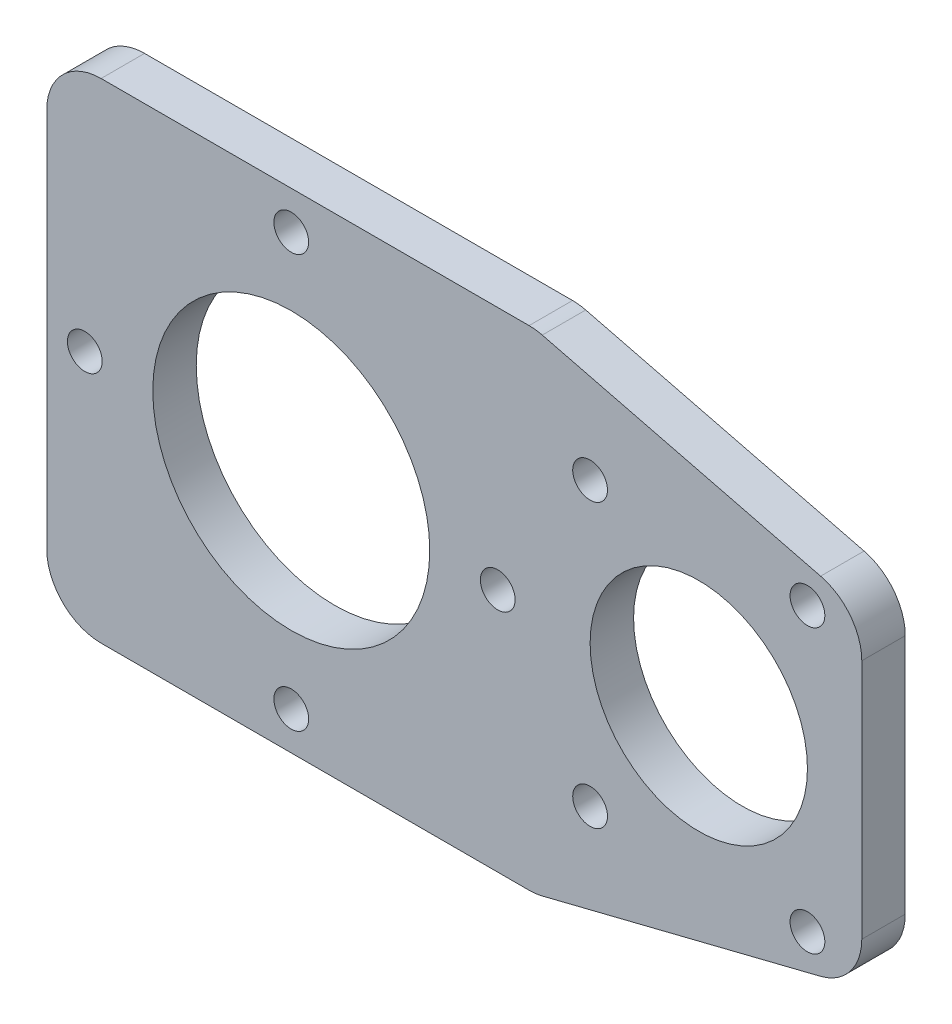
ISO-10303-21;
HEADER;
FILE_DESCRIPTION(('STEP AP214'),'2;1');
FILE_NAME('part.step','',(''),(''),'','','');
FILE_SCHEMA(('AUTOMOTIVE_DESIGN { 1 0 10303 214 1 1 1 1 }'));
ENDSEC;
DATA;
#1=APPLICATION_CONTEXT('core data for automotive mechanical design processes');
#2=APPLICATION_PROTOCOL_DEFINITION('international standard','automotive_design',2000,#1);
#3=PRODUCT_CONTEXT('',#1,'mechanical');
#4=PRODUCT('Part','Part','',(#3));
#5=PRODUCT_RELATED_PRODUCT_CATEGORY('part','',(#4));
#6=PRODUCT_DEFINITION_FORMATION('','',#4);
#7=PRODUCT_DEFINITION_CONTEXT('part definition',#1,'design');
#8=PRODUCT_DEFINITION('design','',#6,#7);
#9=PRODUCT_DEFINITION_SHAPE('','',#8);
#10=(LENGTH_UNIT() NAMED_UNIT(*) SI_UNIT(.MILLI.,.METRE.));
#11=(NAMED_UNIT(*) PLANE_ANGLE_UNIT() SI_UNIT($,.RADIAN.));
#12=(NAMED_UNIT(*) SI_UNIT($,.STERADIAN.) SOLID_ANGLE_UNIT());
#13=UNCERTAINTY_MEASURE_WITH_UNIT(LENGTH_MEASURE(1.E-05),#10,'distance_accuracy_value','');
#14=(GEOMETRIC_REPRESENTATION_CONTEXT(3) GLOBAL_UNCERTAINTY_ASSIGNED_CONTEXT((#13)) GLOBAL_UNIT_ASSIGNED_CONTEXT((#10,
#11,#12)) REPRESENTATION_CONTEXT('',''));
#15=CARTESIAN_POINT('',(0.,0.,0.));
#16=DIRECTION('',(0.,0.,1.));
#17=DIRECTION('',(1.,0.,0.));
#18=AXIS2_PLACEMENT_3D('',#15,#16,#17);
#19=CARTESIAN_POINT('',(0.,0.,4.));
#20=DIRECTION('',(0.,0.,1.));
#21=DIRECTION('',(1.,0.,0.));
#22=AXIS2_PLACEMENT_3D('',#19,#20,#21);
#23=PLANE('',#22);
#24=CARTESIAN_POINT('',(0.,0.,4.));
#25=DIRECTION('',(0.,0.,1.));
#26=DIRECTION('',(1.,0.,0.));
#27=AXIS2_PLACEMENT_3D('',#24,#25,#26);
#28=CIRCLE('',#27,12.7441896946442);
#29=CARTESIAN_POINT('',(12.7441896946442,0.,4.));
#30=VERTEX_POINT('',#29);
#31=EDGE_CURVE('E182',#30,#30,#28,.T.);
#32=ORIENTED_EDGE('',*,*,#31,.F.);
#33=EDGE_LOOP('',(#32));
#34=FACE_BOUND('',#33,.T.);
#35=CARTESIAN_POINT('',(37.5,0.,4.));
#36=DIRECTION('',(0.,0.,1.));
#37=DIRECTION('',(1.,0.,0.));
#38=AXIS2_PLACEMENT_3D('',#35,#36,#37);
#39=CIRCLE('',#38,10.);
#40=CARTESIAN_POINT('',(47.5,0.,4.));
#41=VERTEX_POINT('',#40);
#42=EDGE_CURVE('E554',#41,#41,#39,.T.);
#43=ORIENTED_EDGE('',*,*,#42,.F.);
#44=EDGE_LOOP('',(#43));
#45=FACE_BOUND('',#44,.T.);
#46=CARTESIAN_POINT('',(0.,19.,4.));
#47=DIRECTION('',(0.,0.,1.));
#48=DIRECTION('',(1.,0.,0.));
#49=AXIS2_PLACEMENT_3D('',#46,#47,#48);
#50=CIRCLE('',#49,1.6);
#51=CARTESIAN_POINT('',(1.6,19.,4.));
#52=VERTEX_POINT('',#51);
#53=EDGE_CURVE('E546',#52,#52,#50,.T.);
#54=ORIENTED_EDGE('',*,*,#53,.F.);
#55=EDGE_LOOP('',(#54));
#56=FACE_BOUND('',#55,.T.);
#57=CARTESIAN_POINT('',(0.,-19.,4.));
#58=DIRECTION('',(0.,0.,1.));
#59=DIRECTION('',(-1.,0.,0.));
#60=AXIS2_PLACEMENT_3D('',#57,#58,#59);
#61=CIRCLE('',#60,1.6);
#62=CARTESIAN_POINT('',(-1.6,-19.,4.));
#63=VERTEX_POINT('',#62);
#64=EDGE_CURVE('E185',#63,#63,#61,.T.);
#65=ORIENTED_EDGE('',*,*,#64,.F.);
#66=EDGE_LOOP('',(#65));
#67=FACE_BOUND('',#66,.T.);
#68=CARTESIAN_POINT('',(27.5,-13.,4.));
#69=DIRECTION('',(0.,0.,1.));
#70=DIRECTION('',(-1.,0.,0.));
#71=AXIS2_PLACEMENT_3D('',#68,#69,#70);
#72=CIRCLE('',#71,1.6);
#73=CARTESIAN_POINT('',(25.9,-13.,4.));
#74=VERTEX_POINT('',#73);
#75=EDGE_CURVE('E540',#74,#74,#72,.T.);
#76=ORIENTED_EDGE('',*,*,#75,.F.);
#77=EDGE_LOOP('',(#76));
#78=FACE_BOUND('',#77,.T.);
#79=CARTESIAN_POINT('',(47.5,-13.,4.));
#80=DIRECTION('',(0.,0.,1.));
#81=DIRECTION('',(-1.,0.,0.));
#82=AXIS2_PLACEMENT_3D('',#79,#80,#81);
#83=CIRCLE('',#82,1.6);
#84=CARTESIAN_POINT('',(45.9,-13.,4.));
#85=VERTEX_POINT('',#84);
#86=EDGE_CURVE('E534',#85,#85,#83,.T.);
#87=ORIENTED_EDGE('',*,*,#86,.F.);
#88=EDGE_LOOP('',(#87));
#89=FACE_BOUND('',#88,.T.);
#90=CARTESIAN_POINT('',(47.5,13.,4.));
#91=DIRECTION('',(0.,0.,1.));
#92=DIRECTION('',(1.,0.,0.));
#93=AXIS2_PLACEMENT_3D('',#90,#91,#92);
#94=CIRCLE('',#93,1.6);
#95=CARTESIAN_POINT('',(49.1,13.,4.));
#96=VERTEX_POINT('',#95);
#97=EDGE_CURVE('E522',#96,#96,#94,.T.);
#98=ORIENTED_EDGE('',*,*,#97,.F.);
#99=EDGE_LOOP('',(#98));
#100=FACE_BOUND('',#99,.T.);
#101=CARTESIAN_POINT('',(27.5,13.,4.));
#102=DIRECTION('',(0.,0.,1.));
#103=DIRECTION('',(1.,0.,0.));
#104=AXIS2_PLACEMENT_3D('',#101,#102,#103);
#105=CIRCLE('',#104,1.6);
#106=CARTESIAN_POINT('',(29.1,13.,4.));
#107=VERTEX_POINT('',#106);
#108=EDGE_CURVE('E217',#107,#107,#105,.T.);
#109=ORIENTED_EDGE('',*,*,#108,.F.);
#110=EDGE_LOOP('',(#109));
#111=FACE_BOUND('',#110,.T.);
#112=CARTESIAN_POINT('',(19.,0.,4.));
#113=DIRECTION('',(0.,0.,1.));
#114=DIRECTION('',(1.,0.,0.));
#115=AXIS2_PLACEMENT_3D('',#112,#113,#114);
#116=CIRCLE('',#115,1.6);
#117=CARTESIAN_POINT('',(20.6,0.,4.));
#118=VERTEX_POINT('',#117);
#119=EDGE_CURVE('E230',#118,#118,#116,.T.);
#120=ORIENTED_EDGE('',*,*,#119,.F.);
#121=EDGE_LOOP('',(#120));
#122=FACE_BOUND('',#121,.T.);
#123=DIRECTION('',(1.,0.,0.));
#124=VECTOR('',#123,1.);
#125=CARTESIAN_POINT('',(-22.5,-22.5,4.));
#126=LINE('',#125,#124);
#127=CARTESIAN_POINT('',(-17.5,-22.5,4.));
#128=VERTEX_POINT('',#127);
#129=CARTESIAN_POINT('',(21.8844718719116,-22.5,4.));
#130=VERTEX_POINT('',#129);
#131=EDGE_CURVE('E151',#128,#130,#126,.T.);
#132=ORIENTED_EDGE('',*,*,#131,.T.);
#133=CARTESIAN_POINT('',(21.8844718719117,-17.5,4.));
#134=DIRECTION('',(0.,0.,1.));
#135=DIRECTION('',(1.,0.,0.));
#136=AXIS2_PLACEMENT_3D('',#133,#134,#135);
#137=CIRCLE('',#136,5.);
#138=CARTESIAN_POINT('',(23.0971499970933,-22.3507125007267,4.));
#139=VERTEX_POINT('',#138);
#140=EDGE_CURVE('E11',#130,#139,#137,.T.);
#141=ORIENTED_EDGE('',*,*,#140,.T.);
#142=DIRECTION('',(0.970142500145332,0.242535625036333,0.));
#143=VECTOR('',#142,1.);
#144=CARTESIAN_POINT('',(6.61764705882352,-26.4705882352941,4.));
#145=LINE('',#144,#143);
#146=CARTESIAN_POINT('',(48.7126781251817,-15.9468304687046,4.));
#147=VERTEX_POINT('',#146);
#148=EDGE_CURVE('E123',#139,#147,#145,.T.);
#149=ORIENTED_EDGE('',*,*,#148,.T.);
#150=CARTESIAN_POINT('',(47.5,-11.0961179679779,4.));
#151=DIRECTION('',(0.,0.,1.));
#152=DIRECTION('',(1.,0.,0.));
#153=AXIS2_PLACEMENT_3D('',#150,#151,#152);
#154=CIRCLE('',#153,5.);
#155=CARTESIAN_POINT('',(52.5,-11.0961179679779,4.));
#156=VERTEX_POINT('',#155);
#157=EDGE_CURVE('E127',#147,#156,#154,.T.);
#158=ORIENTED_EDGE('',*,*,#157,.T.);
#159=DIRECTION('',(0.,-1.,0.));
#160=VECTOR('',#159,1.);
#161=CARTESIAN_POINT('',(52.5,0.,4.));
#162=LINE('',#161,#160);
#163=CARTESIAN_POINT('',(52.5,11.0961179679779,4.));
#164=VERTEX_POINT('',#163);
#165=EDGE_CURVE('E134',#164,#156,#162,.T.);
#166=ORIENTED_EDGE('',*,*,#165,.F.);
#167=CARTESIAN_POINT('',(47.5,11.0961179679779,4.));
#168=DIRECTION('',(0.,0.,1.));
#169=DIRECTION('',(1.,0.,0.));
#170=AXIS2_PLACEMENT_3D('',#167,#168,#169);
#171=CIRCLE('',#170,5.);
#172=CARTESIAN_POINT('',(48.7126781251817,15.9468304687046,4.));
#173=VERTEX_POINT('',#172);
#174=EDGE_CURVE('E145',#164,#173,#171,.T.);
#175=ORIENTED_EDGE('',*,*,#174,.T.);
#176=DIRECTION('',(0.970142500145332,-0.242535625036333,0.));
#177=VECTOR('',#176,1.);
#178=CARTESIAN_POINT('',(6.61764705882352,26.4705882352941,4.));
#179=LINE('',#178,#177);
#180=CARTESIAN_POINT('',(23.0971499970933,22.3507125007267,4.));
#181=VERTEX_POINT('',#180);
#182=EDGE_CURVE('E210',#181,#173,#179,.T.);
#183=ORIENTED_EDGE('',*,*,#182,.F.);
#184=CARTESIAN_POINT('',(21.8844718719117,17.5,4.));
#185=DIRECTION('',(0.,0.,1.));
#186=DIRECTION('',(1.,0.,0.));
#187=AXIS2_PLACEMENT_3D('',#184,#185,#186);
#188=CIRCLE('',#187,5.);
#189=CARTESIAN_POINT('',(21.8844718719117,22.5,4.));
#190=VERTEX_POINT('',#189);
#191=EDGE_CURVE('E150',#181,#190,#188,.T.);
#192=ORIENTED_EDGE('',*,*,#191,.T.);
#193=DIRECTION('',(-1.,0.,0.));
#194=VECTOR('',#193,1.);
#195=CARTESIAN_POINT('',(-22.5,22.5,4.));
#196=LINE('',#195,#194);
#197=CARTESIAN_POINT('',(-17.5,22.5,4.));
#198=VERTEX_POINT('',#197);
#199=EDGE_CURVE('E236',#190,#198,#196,.T.);
#200=ORIENTED_EDGE('',*,*,#199,.T.);
#201=CARTESIAN_POINT('',(-17.5,17.5,4.));
#202=DIRECTION('',(0.,0.,1.));
#203=DIRECTION('',(1.,0.,0.));
#204=AXIS2_PLACEMENT_3D('',#201,#202,#203);
#205=CIRCLE('',#204,5.);
#206=CARTESIAN_POINT('',(-22.5,17.5,4.));
#207=VERTEX_POINT('',#206);
#208=EDGE_CURVE('E197',#198,#207,#205,.T.);
#209=ORIENTED_EDGE('',*,*,#208,.T.);
#210=DIRECTION('',(0.,-1.,0.));
#211=VECTOR('',#210,1.);
#212=CARTESIAN_POINT('',(-22.5,22.5,4.));
#213=LINE('',#212,#211);
#214=CARTESIAN_POINT('',(-22.5,-17.5,4.));
#215=VERTEX_POINT('',#214);
#216=EDGE_CURVE('E154',#207,#215,#213,.T.);
#217=ORIENTED_EDGE('',*,*,#216,.T.);
#218=CARTESIAN_POINT('',(-17.5,-17.5,4.));
#219=DIRECTION('',(0.,0.,1.));
#220=DIRECTION('',(1.,0.,0.));
#221=AXIS2_PLACEMENT_3D('',#218,#219,#220);
#222=CIRCLE('',#221,5.);
#223=EDGE_CURVE('E199',#215,#128,#222,.T.);
#224=ORIENTED_EDGE('',*,*,#223,.T.);
#225=EDGE_LOOP('',(#132,#141,#149,#158,#166,#175,#183,#192,#200,#209,#217,#224));
#226=FACE_BOUND('',#225,.T.);
#227=CARTESIAN_POINT('',(-19.,0.,4.));
#228=DIRECTION('',(0.,0.,1.));
#229=DIRECTION('',(-1.,0.,0.));
#230=AXIS2_PLACEMENT_3D('',#227,#228,#229);
#231=CIRCLE('',#230,1.6);
#232=CARTESIAN_POINT('',(-20.6,0.,4.));
#233=VERTEX_POINT('',#232);
#234=EDGE_CURVE('E224',#233,#233,#231,.T.);
#235=ORIENTED_EDGE('',*,*,#234,.F.);
#236=EDGE_LOOP('',(#235));
#237=FACE_BOUND('',#236,.T.);
#238=ADVANCED_FACE('F35',(#34,#45,#56,#67,#78,#89,#100,#111,#122,#226,#237),#23,.T.);
#239=CARTESIAN_POINT('',(0.,0.,0.));
#240=DIRECTION('',(0.,0.,1.));
#241=DIRECTION('',(1.,0.,0.));
#242=AXIS2_PLACEMENT_3D('',#239,#240,#241);
#243=PLANE('',#242);
#244=CARTESIAN_POINT('',(0.,0.,0.));
#245=DIRECTION('',(0.,0.,1.));
#246=DIRECTION('',(1.,0.,0.));
#247=AXIS2_PLACEMENT_3D('',#244,#245,#246);
#248=CIRCLE('',#247,12.7441896946442);
#249=CARTESIAN_POINT('',(12.7441896946442,0.,0.));
#250=VERTEX_POINT('',#249);
#251=EDGE_CURVE('E181',#250,#250,#248,.T.);
#252=ORIENTED_EDGE('',*,*,#251,.T.);
#253=EDGE_LOOP('',(#252));
#254=FACE_BOUND('',#253,.T.);
#255=CARTESIAN_POINT('',(37.5,0.,0.));
#256=DIRECTION('',(0.,0.,1.));
#257=DIRECTION('',(1.,0.,0.));
#258=AXIS2_PLACEMENT_3D('',#255,#256,#257);
#259=CIRCLE('',#258,10.);
#260=CARTESIAN_POINT('',(47.5,0.,0.));
#261=VERTEX_POINT('',#260);
#262=EDGE_CURVE('E178',#261,#261,#259,.T.);
#263=ORIENTED_EDGE('',*,*,#262,.T.);
#264=EDGE_LOOP('',(#263));
#265=FACE_BOUND('',#264,.T.);
#266=CARTESIAN_POINT('',(0.,19.,0.));
#267=DIRECTION('',(0.,0.,1.));
#268=DIRECTION('',(1.,0.,0.));
#269=AXIS2_PLACEMENT_3D('',#266,#267,#268);
#270=CIRCLE('',#269,1.6);
#271=CARTESIAN_POINT('',(1.6,19.,0.));
#272=VERTEX_POINT('',#271);
#273=EDGE_CURVE('E542',#272,#272,#270,.T.);
#274=ORIENTED_EDGE('',*,*,#273,.T.);
#275=EDGE_LOOP('',(#274));
#276=FACE_BOUND('',#275,.T.);
#277=CARTESIAN_POINT('',(0.,-19.,0.));
#278=DIRECTION('',(0.,0.,1.));
#279=DIRECTION('',(-1.,0.,0.));
#280=AXIS2_PLACEMENT_3D('',#277,#278,#279);
#281=CIRCLE('',#280,1.6);
#282=CARTESIAN_POINT('',(-1.6,-19.,0.));
#283=VERTEX_POINT('',#282);
#284=EDGE_CURVE('E551',#283,#283,#281,.T.);
#285=ORIENTED_EDGE('',*,*,#284,.T.);
#286=EDGE_LOOP('',(#285));
#287=FACE_BOUND('',#286,.T.);
#288=CARTESIAN_POINT('',(27.5,-13.,0.));
#289=DIRECTION('',(0.,0.,1.));
#290=DIRECTION('',(-1.,0.,0.));
#291=AXIS2_PLACEMENT_3D('',#288,#289,#290);
#292=CIRCLE('',#291,1.6);
#293=CARTESIAN_POINT('',(25.9,-13.,0.));
#294=VERTEX_POINT('',#293);
#295=EDGE_CURVE('E537',#294,#294,#292,.T.);
#296=ORIENTED_EDGE('',*,*,#295,.T.);
#297=EDGE_LOOP('',(#296));
#298=FACE_BOUND('',#297,.T.);
#299=CARTESIAN_POINT('',(47.5,-13.,0.));
#300=DIRECTION('',(0.,0.,1.));
#301=DIRECTION('',(-1.,0.,0.));
#302=AXIS2_PLACEMENT_3D('',#299,#300,#301);
#303=CIRCLE('',#302,1.6);
#304=CARTESIAN_POINT('',(45.9,-13.,0.));
#305=VERTEX_POINT('',#304);
#306=EDGE_CURVE('E527',#305,#305,#303,.T.);
#307=ORIENTED_EDGE('',*,*,#306,.T.);
#308=EDGE_LOOP('',(#307));
#309=FACE_BOUND('',#308,.T.);
#310=CARTESIAN_POINT('',(47.5,13.,0.));
#311=DIRECTION('',(0.,0.,1.));
#312=DIRECTION('',(1.,0.,0.));
#313=AXIS2_PLACEMENT_3D('',#310,#311,#312);
#314=CIRCLE('',#313,1.6);
#315=CARTESIAN_POINT('',(49.1,13.,0.));
#316=VERTEX_POINT('',#315);
#317=EDGE_CURVE('E520',#316,#316,#314,.T.);
#318=ORIENTED_EDGE('',*,*,#317,.T.);
#319=EDGE_LOOP('',(#318));
#320=FACE_BOUND('',#319,.T.);
#321=CARTESIAN_POINT('',(27.5,13.,0.));
#322=DIRECTION('',(0.,0.,1.));
#323=DIRECTION('',(1.,0.,0.));
#324=AXIS2_PLACEMENT_3D('',#321,#322,#323);
#325=CIRCLE('',#324,1.6);
#326=CARTESIAN_POINT('',(29.1,13.,0.));
#327=VERTEX_POINT('',#326);
#328=EDGE_CURVE('E135',#327,#327,#325,.T.);
#329=ORIENTED_EDGE('',*,*,#328,.T.);
#330=EDGE_LOOP('',(#329));
#331=FACE_BOUND('',#330,.T.);
#332=DIRECTION('',(0.970142500145332,0.242535625036333,0.));
#333=VECTOR('',#332,1.);
#334=CARTESIAN_POINT('',(6.61764705882352,-26.4705882352941,0.));
#335=LINE('',#334,#333);
#336=CARTESIAN_POINT('',(23.0971499970933,-22.3507125007267,0.));
#337=VERTEX_POINT('',#336);
#338=CARTESIAN_POINT('',(48.7126781251817,-15.9468304687046,0.));
#339=VERTEX_POINT('',#338);
#340=EDGE_CURVE('E148',#337,#339,#335,.T.);
#341=ORIENTED_EDGE('',*,*,#340,.F.);
#342=CARTESIAN_POINT('',(21.8844718719117,-17.5,0.));
#343=DIRECTION('',(0.,0.,1.));
#344=DIRECTION('',(1.,0.,0.));
#345=AXIS2_PLACEMENT_3D('',#342,#343,#344);
#346=CIRCLE('',#345,5.);
#347=CARTESIAN_POINT('',(21.8844718719116,-22.5,0.));
#348=VERTEX_POINT('',#347);
#349=EDGE_CURVE('E57',#337,#348,#346,.F.);
#350=ORIENTED_EDGE('',*,*,#349,.T.);
#351=DIRECTION('',(1.,0.,0.));
#352=VECTOR('',#351,1.);
#353=CARTESIAN_POINT('',(-22.5,-22.5,0.));
#354=LINE('',#353,#352);
#355=CARTESIAN_POINT('',(-17.5,-22.5,0.));
#356=VERTEX_POINT('',#355);
#357=EDGE_CURVE('E157',#356,#348,#354,.T.);
#358=ORIENTED_EDGE('',*,*,#357,.F.);
#359=CARTESIAN_POINT('',(-17.5,-17.5,0.));
#360=DIRECTION('',(0.,0.,1.));
#361=DIRECTION('',(1.,0.,0.));
#362=AXIS2_PLACEMENT_3D('',#359,#360,#361);
#363=CIRCLE('',#362,5.);
#364=CARTESIAN_POINT('',(-22.5,-17.5,0.));
#365=VERTEX_POINT('',#364);
#366=EDGE_CURVE('E190',#356,#365,#363,.F.);
#367=ORIENTED_EDGE('',*,*,#366,.T.);
#368=DIRECTION('',(0.,-1.,0.));
#369=VECTOR('',#368,1.);
#370=CARTESIAN_POINT('',(-22.5,22.5,0.));
#371=LINE('',#370,#369);
#372=CARTESIAN_POINT('',(-22.5,17.5,0.));
#373=VERTEX_POINT('',#372);
#374=EDGE_CURVE('E242',#373,#365,#371,.T.);
#375=ORIENTED_EDGE('',*,*,#374,.F.);
#376=CARTESIAN_POINT('',(-17.5,17.5,0.));
#377=DIRECTION('',(0.,0.,1.));
#378=DIRECTION('',(1.,0.,0.));
#379=AXIS2_PLACEMENT_3D('',#376,#377,#378);
#380=CIRCLE('',#379,5.);
#381=CARTESIAN_POINT('',(-17.5,22.5,0.));
#382=VERTEX_POINT('',#381);
#383=EDGE_CURVE('E188',#373,#382,#380,.F.);
#384=ORIENTED_EDGE('',*,*,#383,.T.);
#385=DIRECTION('',(-1.,0.,0.));
#386=VECTOR('',#385,1.);
#387=CARTESIAN_POINT('',(-22.5,22.5,0.));
#388=LINE('',#387,#386);
#389=CARTESIAN_POINT('',(21.8844718719117,22.5,0.));
#390=VERTEX_POINT('',#389);
#391=EDGE_CURVE('E233',#390,#382,#388,.T.);
#392=ORIENTED_EDGE('',*,*,#391,.F.);
#393=CARTESIAN_POINT('',(21.8844718719117,17.5,0.));
#394=DIRECTION('',(0.,0.,1.));
#395=DIRECTION('',(1.,0.,0.));
#396=AXIS2_PLACEMENT_3D('',#393,#394,#395);
#397=CIRCLE('',#396,5.);
#398=CARTESIAN_POINT('',(23.0971499970933,22.3507125007267,0.));
#399=VERTEX_POINT('',#398);
#400=EDGE_CURVE('E164',#390,#399,#397,.F.);
#401=ORIENTED_EDGE('',*,*,#400,.T.);
#402=DIRECTION('',(0.970142500145332,-0.242535625036333,0.));
#403=VECTOR('',#402,1.);
#404=CARTESIAN_POINT('',(6.61764705882352,26.4705882352941,0.));
#405=LINE('',#404,#403);
#406=CARTESIAN_POINT('',(48.7126781251817,15.9468304687046,0.));
#407=VERTEX_POINT('',#406);
#408=EDGE_CURVE('E212',#399,#407,#405,.T.);
#409=ORIENTED_EDGE('',*,*,#408,.T.);
#410=CARTESIAN_POINT('',(47.5,11.0961179679779,0.));
#411=DIRECTION('',(0.,0.,1.));
#412=DIRECTION('',(1.,0.,0.));
#413=AXIS2_PLACEMENT_3D('',#410,#411,#412);
#414=CIRCLE('',#413,5.);
#415=CARTESIAN_POINT('',(52.5,11.0961179679779,0.));
#416=VERTEX_POINT('',#415);
#417=EDGE_CURVE('E166',#407,#416,#414,.F.);
#418=ORIENTED_EDGE('',*,*,#417,.T.);
#419=DIRECTION('',(0.,-1.,0.));
#420=VECTOR('',#419,1.);
#421=CARTESIAN_POINT('',(52.5,0.,0.));
#422=LINE('',#421,#420);
#423=CARTESIAN_POINT('',(52.5,-11.0961179679779,0.));
#424=VERTEX_POINT('',#423);
#425=EDGE_CURVE('E209',#416,#424,#422,.T.);
#426=ORIENTED_EDGE('',*,*,#425,.T.);
#427=CARTESIAN_POINT('',(47.5,-11.0961179679779,0.));
#428=DIRECTION('',(0.,0.,1.));
#429=DIRECTION('',(1.,0.,0.));
#430=AXIS2_PLACEMENT_3D('',#427,#428,#429);
#431=CIRCLE('',#430,5.);
#432=EDGE_CURVE('E168',#424,#339,#431,.F.);
#433=ORIENTED_EDGE('',*,*,#432,.T.);
#434=EDGE_LOOP('',(#341,#350,#358,#367,#375,#384,#392,#401,#409,#418,#426,#433));
#435=FACE_BOUND('',#434,.T.);
#436=CARTESIAN_POINT('',(19.,0.,0.));
#437=DIRECTION('',(0.,0.,1.));
#438=DIRECTION('',(1.,0.,0.));
#439=AXIS2_PLACEMENT_3D('',#436,#437,#438);
#440=CIRCLE('',#439,1.6);
#441=CARTESIAN_POINT('',(20.6,0.,0.));
#442=VERTEX_POINT('',#441);
#443=EDGE_CURVE('E227',#442,#442,#440,.T.);
#444=ORIENTED_EDGE('',*,*,#443,.T.);
#445=EDGE_LOOP('',(#444));
#446=FACE_BOUND('',#445,.T.);
#447=CARTESIAN_POINT('',(-19.,0.,0.));
#448=DIRECTION('',(0.,0.,1.));
#449=DIRECTION('',(-1.,0.,0.));
#450=AXIS2_PLACEMENT_3D('',#447,#448,#449);
#451=CIRCLE('',#450,1.6);
#452=CARTESIAN_POINT('',(-20.6,0.,0.));
#453=VERTEX_POINT('',#452);
#454=EDGE_CURVE('E221',#453,#453,#451,.T.);
#455=ORIENTED_EDGE('',*,*,#454,.T.);
#456=EDGE_LOOP('',(#455));
#457=FACE_BOUND('',#456,.T.);
#458=ADVANCED_FACE('F206',(#254,#265,#276,#287,#298,#309,#320,#331,#435,#446,#457),#243,.F.);
#459=CARTESIAN_POINT('',(-22.5,22.5,4.));
#460=DIRECTION('',(0.,-1.,0.));
#461=DIRECTION('',(0.,0.,-1.));
#462=AXIS2_PLACEMENT_3D('',#459,#460,#461);
#463=PLANE('',#462);
#464=ORIENTED_EDGE('',*,*,#391,.T.);
#465=DIRECTION('',(0.,0.,-1.));
#466=VECTOR('',#465,1.);
#467=CARTESIAN_POINT('',(-17.5,22.5,4.));
#468=LINE('',#467,#466);
#469=EDGE_CURVE('E201',#382,#198,#468,.F.);
#470=ORIENTED_EDGE('',*,*,#469,.T.);
#471=ORIENTED_EDGE('',*,*,#199,.F.);
#472=DIRECTION('',(0.,0.,-1.));
#473=VECTOR('',#472,1.);
#474=CARTESIAN_POINT('',(21.8844718719117,22.5,4.));
#475=LINE('',#474,#473);
#476=EDGE_CURVE('E174',#190,#390,#475,.T.);
#477=ORIENTED_EDGE('',*,*,#476,.T.);
#478=EDGE_LOOP('',(#464,#470,#471,#477));
#479=FACE_BOUND('',#478,.T.);
#480=ADVANCED_FACE('F262',(#479),#463,.F.);
#481=CARTESIAN_POINT('',(-22.5,22.5,4.));
#482=DIRECTION('',(1.,0.,0.));
#483=DIRECTION('',(0.,0.,-1.));
#484=AXIS2_PLACEMENT_3D('',#481,#482,#483);
#485=PLANE('',#484);
#486=ORIENTED_EDGE('',*,*,#374,.T.);
#487=DIRECTION('',(0.,0.,-1.));
#488=VECTOR('',#487,1.);
#489=CARTESIAN_POINT('',(-22.5,-17.5,4.));
#490=LINE('',#489,#488);
#491=EDGE_CURVE('E195',#365,#215,#490,.F.);
#492=ORIENTED_EDGE('',*,*,#491,.T.);
#493=ORIENTED_EDGE('',*,*,#216,.F.);
#494=DIRECTION('',(0.,0.,-1.));
#495=VECTOR('',#494,1.);
#496=CARTESIAN_POINT('',(-22.5,17.5,4.));
#497=LINE('',#496,#495);
#498=EDGE_CURVE('E192',#207,#373,#497,.T.);
#499=ORIENTED_EDGE('',*,*,#498,.T.);
#500=EDGE_LOOP('',(#486,#492,#493,#499));
#501=FACE_BOUND('',#500,.T.);
#502=ADVANCED_FACE('F273',(#501),#485,.F.);
#503=CARTESIAN_POINT('',(-22.5,-22.5,4.));
#504=DIRECTION('',(0.,1.,0.));
#505=DIRECTION('',(-1.,0.,0.));
#506=AXIS2_PLACEMENT_3D('',#503,#504,#505);
#507=PLANE('',#506);
#508=ORIENTED_EDGE('',*,*,#357,.T.);
#509=DIRECTION('',(0.,0.,-1.));
#510=VECTOR('',#509,1.);
#511=CARTESIAN_POINT('',(21.8844718719117,-22.5,4.));
#512=LINE('',#511,#510);
#513=EDGE_CURVE('E43',#348,#130,#512,.F.);
#514=ORIENTED_EDGE('',*,*,#513,.T.);
#515=ORIENTED_EDGE('',*,*,#131,.F.);
#516=DIRECTION('',(0.,0.,-1.));
#517=VECTOR('',#516,1.);
#518=CARTESIAN_POINT('',(-17.5,-22.5,4.));
#519=LINE('',#518,#517);
#520=EDGE_CURVE('E177',#128,#356,#519,.T.);
#521=ORIENTED_EDGE('',*,*,#520,.T.);
#522=EDGE_LOOP('',(#508,#514,#515,#521));
#523=FACE_BOUND('',#522,.T.);
#524=ADVANCED_FACE('F247',(#523),#507,.F.);
#525=CARTESIAN_POINT('',(19.,0.,4.));
#526=DIRECTION('',(0.,0.,-1.));
#527=DIRECTION('',(-1.,0.,0.));
#528=AXIS2_PLACEMENT_3D('',#525,#526,#527);
#529=CYLINDRICAL_SURFACE('',#528,1.6);
#530=ORIENTED_EDGE('',*,*,#119,.T.);
#531=EDGE_LOOP('',(#530));
#532=FACE_BOUND('',#531,.T.);
#533=ORIENTED_EDGE('',*,*,#443,.F.);
#534=EDGE_LOOP('',(#533));
#535=FACE_BOUND('',#534,.T.);
#536=ADVANCED_FACE('F268',(#532,#535),#529,.F.);
#537=CARTESIAN_POINT('',(-19.,0.,4.));
#538=DIRECTION('',(0.,0.,-1.));
#539=DIRECTION('',(-1.,0.,0.));
#540=AXIS2_PLACEMENT_3D('',#537,#538,#539);
#541=CYLINDRICAL_SURFACE('',#540,1.6);
#542=ORIENTED_EDGE('',*,*,#234,.T.);
#543=EDGE_LOOP('',(#542));
#544=FACE_BOUND('',#543,.T.);
#545=ORIENTED_EDGE('',*,*,#454,.F.);
#546=EDGE_LOOP('',(#545));
#547=FACE_BOUND('',#546,.T.);
#548=ADVANCED_FACE('F328',(#544,#547),#541,.F.);
#549=CARTESIAN_POINT('',(6.61764705882352,26.4705882352941,0.));
#550=DIRECTION('',(-0.242535625036333,-0.970142500145332,0.));
#551=DIRECTION('',(0.970142500145332,-0.242535625036333,0.));
#552=AXIS2_PLACEMENT_3D('',#549,#550,#551);
#553=PLANE('',#552);
#554=ORIENTED_EDGE('',*,*,#182,.T.);
#555=DIRECTION('',(0.,0.,1.));
#556=VECTOR('',#555,1.);
#557=CARTESIAN_POINT('',(48.7126781251817,15.9468304687046,0.));
#558=LINE('',#557,#556);
#559=EDGE_CURVE('E172',#173,#407,#558,.F.);
#560=ORIENTED_EDGE('',*,*,#559,.T.);
#561=ORIENTED_EDGE('',*,*,#408,.F.);
#562=DIRECTION('',(0.,0.,-1.));
#563=VECTOR('',#562,1.);
#564=CARTESIAN_POINT('',(23.0971499970933,22.3507125007267,0.));
#565=LINE('',#564,#563);
#566=EDGE_CURVE('E170',#399,#181,#565,.F.);
#567=ORIENTED_EDGE('',*,*,#566,.T.);
#568=EDGE_LOOP('',(#554,#560,#561,#567));
#569=FACE_BOUND('',#568,.T.);
#570=ADVANCED_FACE('F313',(#569),#553,.F.);
#571=CARTESIAN_POINT('',(52.5,0.,0.));
#572=DIRECTION('',(-1.,0.,0.));
#573=DIRECTION('',(0.,0.,1.));
#574=AXIS2_PLACEMENT_3D('',#571,#572,#573);
#575=PLANE('',#574);
#576=ORIENTED_EDGE('',*,*,#165,.T.);
#577=DIRECTION('',(0.,0.,1.));
#578=VECTOR('',#577,1.);
#579=CARTESIAN_POINT('',(52.5,-11.0961179679779,0.));
#580=LINE('',#579,#578);
#581=EDGE_CURVE('E143',#156,#424,#580,.F.);
#582=ORIENTED_EDGE('',*,*,#581,.T.);
#583=ORIENTED_EDGE('',*,*,#425,.F.);
#584=DIRECTION('',(0.,0.,1.));
#585=VECTOR('',#584,1.);
#586=CARTESIAN_POINT('',(52.5,11.0961179679779,0.));
#587=LINE('',#586,#585);
#588=EDGE_CURVE('E144',#416,#164,#587,.T.);
#589=ORIENTED_EDGE('',*,*,#588,.T.);
#590=EDGE_LOOP('',(#576,#582,#583,#589));
#591=FACE_BOUND('',#590,.T.);
#592=ADVANCED_FACE('F319',(#591),#575,.F.);
#593=CARTESIAN_POINT('',(6.61764705882352,-26.4705882352941,0.));
#594=DIRECTION('',(0.242535625036333,-0.970142500145332,0.));
#595=DIRECTION('',(0.970142500145332,0.242535625036333,0.));
#596=AXIS2_PLACEMENT_3D('',#593,#594,#595);
#597=PLANE('',#596);
#598=ORIENTED_EDGE('',*,*,#148,.F.);
#599=DIRECTION('',(0.,0.,-1.));
#600=VECTOR('',#599,1.);
#601=CARTESIAN_POINT('',(23.0971499970933,-22.3507125007267,0.));
#602=LINE('',#601,#600);
#603=EDGE_CURVE('E203',#139,#337,#602,.T.);
#604=ORIENTED_EDGE('',*,*,#603,.T.);
#605=ORIENTED_EDGE('',*,*,#340,.T.);
#606=DIRECTION('',(0.,0.,1.));
#607=VECTOR('',#606,1.);
#608=CARTESIAN_POINT('',(48.7126781251817,-15.9468304687046,4.));
#609=LINE('',#608,#607);
#610=EDGE_CURVE('E142',#339,#147,#609,.T.);
#611=ORIENTED_EDGE('',*,*,#610,.T.);
#612=EDGE_LOOP('',(#598,#604,#605,#611));
#613=FACE_BOUND('',#612,.T.);
#614=ADVANCED_FACE('F147',(#613),#597,.T.);
#615=CARTESIAN_POINT('',(27.5,13.,0.));
#616=DIRECTION('',(0.,0.,1.));
#617=DIRECTION('',(1.,0.,0.));
#618=AXIS2_PLACEMENT_3D('',#615,#616,#617);
#619=CYLINDRICAL_SURFACE('',#618,1.6);
#620=ORIENTED_EDGE('',*,*,#328,.F.);
#621=EDGE_LOOP('',(#620));
#622=FACE_BOUND('',#621,.T.);
#623=ORIENTED_EDGE('',*,*,#108,.T.);
#624=EDGE_LOOP('',(#623));
#625=FACE_BOUND('',#624,.T.);
#626=ADVANCED_FACE('F326',(#622,#625),#619,.F.);
#627=CARTESIAN_POINT('',(47.5,13.,0.));
#628=DIRECTION('',(0.,0.,1.));
#629=DIRECTION('',(1.,0.,0.));
#630=AXIS2_PLACEMENT_3D('',#627,#628,#629);
#631=CYLINDRICAL_SURFACE('',#630,1.6);
#632=ORIENTED_EDGE('',*,*,#317,.F.);
#633=EDGE_LOOP('',(#632));
#634=FACE_BOUND('',#633,.T.);
#635=ORIENTED_EDGE('',*,*,#97,.T.);
#636=EDGE_LOOP('',(#635));
#637=FACE_BOUND('',#636,.T.);
#638=ADVANCED_FACE('F447',(#634,#637),#631,.F.);
#639=CARTESIAN_POINT('',(47.5,-13.,0.));
#640=DIRECTION('',(0.,0.,1.));
#641=DIRECTION('',(1.,0.,0.));
#642=AXIS2_PLACEMENT_3D('',#639,#640,#641);
#643=CYLINDRICAL_SURFACE('',#642,1.6);
#644=ORIENTED_EDGE('',*,*,#306,.F.);
#645=EDGE_LOOP('',(#644));
#646=FACE_BOUND('',#645,.T.);
#647=ORIENTED_EDGE('',*,*,#86,.T.);
#648=EDGE_LOOP('',(#647));
#649=FACE_BOUND('',#648,.T.);
#650=ADVANCED_FACE('F437',(#646,#649),#643,.F.);
#651=CARTESIAN_POINT('',(27.5,-13.,0.));
#652=DIRECTION('',(0.,0.,1.));
#653=DIRECTION('',(1.,0.,0.));
#654=AXIS2_PLACEMENT_3D('',#651,#652,#653);
#655=CYLINDRICAL_SURFACE('',#654,1.6);
#656=ORIENTED_EDGE('',*,*,#295,.F.);
#657=EDGE_LOOP('',(#656));
#658=FACE_BOUND('',#657,.T.);
#659=ORIENTED_EDGE('',*,*,#75,.T.);
#660=EDGE_LOOP('',(#659));
#661=FACE_BOUND('',#660,.T.);
#662=ADVANCED_FACE('F282',(#658,#661),#655,.F.);
#663=CARTESIAN_POINT('',(47.5,-11.0961179679779,0.));
#664=DIRECTION('',(0.,0.,-1.));
#665=DIRECTION('',(-1.,0.,0.));
#666=AXIS2_PLACEMENT_3D('',#663,#664,#665);
#667=CYLINDRICAL_SURFACE('',#666,5.);
#668=ORIENTED_EDGE('',*,*,#432,.F.);
#669=ORIENTED_EDGE('',*,*,#581,.F.);
#670=ORIENTED_EDGE('',*,*,#157,.F.);
#671=ORIENTED_EDGE('',*,*,#610,.F.);
#672=EDGE_LOOP('',(#668,#669,#670,#671));
#673=FACE_BOUND('',#672,.T.);
#674=ADVANCED_FACE('F141',(#673),#667,.T.);
#675=CARTESIAN_POINT('',(47.5,11.0961179679779,0.));
#676=DIRECTION('',(0.,0.,1.));
#677=DIRECTION('',(1.,0.,0.));
#678=AXIS2_PLACEMENT_3D('',#675,#676,#677);
#679=CYLINDRICAL_SURFACE('',#678,5.);
#680=ORIENTED_EDGE('',*,*,#417,.F.);
#681=ORIENTED_EDGE('',*,*,#559,.F.);
#682=ORIENTED_EDGE('',*,*,#174,.F.);
#683=ORIENTED_EDGE('',*,*,#588,.F.);
#684=EDGE_LOOP('',(#680,#681,#682,#683));
#685=FACE_BOUND('',#684,.T.);
#686=ADVANCED_FACE('F281',(#685),#679,.T.);
#687=CARTESIAN_POINT('',(21.8844718719117,17.5,4.));
#688=DIRECTION('',(0.,0.,-1.));
#689=DIRECTION('',(-1.,0.,0.));
#690=AXIS2_PLACEMENT_3D('',#687,#688,#689);
#691=CYLINDRICAL_SURFACE('',#690,5.);
#692=ORIENTED_EDGE('',*,*,#191,.F.);
#693=ORIENTED_EDGE('',*,*,#566,.F.);
#694=ORIENTED_EDGE('',*,*,#400,.F.);
#695=ORIENTED_EDGE('',*,*,#476,.F.);
#696=EDGE_LOOP('',(#692,#693,#694,#695));
#697=FACE_BOUND('',#696,.T.);
#698=ADVANCED_FACE('F285',(#697),#691,.T.);
#699=CARTESIAN_POINT('',(0.,-19.,0.));
#700=DIRECTION('',(0.,0.,1.));
#701=DIRECTION('',(1.,0.,0.));
#702=AXIS2_PLACEMENT_3D('',#699,#700,#701);
#703=CYLINDRICAL_SURFACE('',#702,1.6);
#704=ORIENTED_EDGE('',*,*,#284,.F.);
#705=EDGE_LOOP('',(#704));
#706=FACE_BOUND('',#705,.T.);
#707=ORIENTED_EDGE('',*,*,#64,.T.);
#708=EDGE_LOOP('',(#707));
#709=FACE_BOUND('',#708,.T.);
#710=ADVANCED_FACE('F289',(#706,#709),#703,.F.);
#711=CARTESIAN_POINT('',(0.,19.,0.));
#712=DIRECTION('',(0.,0.,1.));
#713=DIRECTION('',(1.,0.,0.));
#714=AXIS2_PLACEMENT_3D('',#711,#712,#713);
#715=CYLINDRICAL_SURFACE('',#714,1.6);
#716=ORIENTED_EDGE('',*,*,#273,.F.);
#717=EDGE_LOOP('',(#716));
#718=FACE_BOUND('',#717,.T.);
#719=ORIENTED_EDGE('',*,*,#53,.T.);
#720=EDGE_LOOP('',(#719));
#721=FACE_BOUND('',#720,.T.);
#722=ADVANCED_FACE('F397',(#718,#721),#715,.F.);
#723=CARTESIAN_POINT('',(37.5,0.,-6.));
#724=DIRECTION('',(0.,0.,1.));
#725=DIRECTION('',(1.,0.,0.));
#726=AXIS2_PLACEMENT_3D('',#723,#724,#725);
#727=CYLINDRICAL_SURFACE('',#726,10.);
#728=ORIENTED_EDGE('',*,*,#42,.T.);
#729=EDGE_LOOP('',(#728));
#730=FACE_BOUND('',#729,.T.);
#731=ORIENTED_EDGE('',*,*,#262,.F.);
#732=EDGE_LOOP('',(#731));
#733=FACE_BOUND('',#732,.T.);
#734=ADVANCED_FACE('F297',(#730,#733),#727,.F.);
#735=CARTESIAN_POINT('',(0.,0.,-6.));
#736=DIRECTION('',(0.,0.,1.));
#737=DIRECTION('',(1.,0.,0.));
#738=AXIS2_PLACEMENT_3D('',#735,#736,#737);
#739=CYLINDRICAL_SURFACE('',#738,12.7441896946442);
#740=ORIENTED_EDGE('',*,*,#31,.T.);
#741=EDGE_LOOP('',(#740));
#742=FACE_BOUND('',#741,.T.);
#743=ORIENTED_EDGE('',*,*,#251,.F.);
#744=EDGE_LOOP('',(#743));
#745=FACE_BOUND('',#744,.T.);
#746=ADVANCED_FACE('F292',(#742,#745),#739,.F.);
#747=CARTESIAN_POINT('',(-17.5,-17.5,4.));
#748=DIRECTION('',(0.,0.,-1.));
#749=DIRECTION('',(-1.,0.,0.));
#750=AXIS2_PLACEMENT_3D('',#747,#748,#749);
#751=CYLINDRICAL_SURFACE('',#750,5.);
#752=ORIENTED_EDGE('',*,*,#223,.F.);
#753=ORIENTED_EDGE('',*,*,#491,.F.);
#754=ORIENTED_EDGE('',*,*,#366,.F.);
#755=ORIENTED_EDGE('',*,*,#520,.F.);
#756=EDGE_LOOP('',(#752,#753,#754,#755));
#757=FACE_BOUND('',#756,.T.);
#758=ADVANCED_FACE('F254',(#757),#751,.T.);
#759=CARTESIAN_POINT('',(-17.5,17.5,4.));
#760=DIRECTION('',(0.,0.,-1.));
#761=DIRECTION('',(-1.,0.,0.));
#762=AXIS2_PLACEMENT_3D('',#759,#760,#761);
#763=CYLINDRICAL_SURFACE('',#762,5.);
#764=ORIENTED_EDGE('',*,*,#208,.F.);
#765=ORIENTED_EDGE('',*,*,#469,.F.);
#766=ORIENTED_EDGE('',*,*,#383,.F.);
#767=ORIENTED_EDGE('',*,*,#498,.F.);
#768=EDGE_LOOP('',(#764,#765,#766,#767));
#769=FACE_BOUND('',#768,.T.);
#770=ADVANCED_FACE('F250',(#769),#763,.T.);
#771=CARTESIAN_POINT('',(21.8844718719117,-17.5,0.));
#772=DIRECTION('',(0.,0.,1.));
#773=DIRECTION('',(1.,0.,0.));
#774=AXIS2_PLACEMENT_3D('',#771,#772,#773);
#775=CYLINDRICAL_SURFACE('',#774,5.);
#776=ORIENTED_EDGE('',*,*,#140,.F.);
#777=ORIENTED_EDGE('',*,*,#513,.F.);
#778=ORIENTED_EDGE('',*,*,#349,.F.);
#779=ORIENTED_EDGE('',*,*,#603,.F.);
#780=EDGE_LOOP('',(#776,#777,#778,#779));
#781=FACE_BOUND('',#780,.T.);
#782=ADVANCED_FACE('F37',(#781),#775,.T.);
#783=CLOSED_SHELL('',(#238,#458,#480,#502,#524,#536,#548,#570,#592,#614,#626,#638,#650,#662,
#674,#686,#698,#710,#722,#734,#746,#758,#770,#782));
#784=MANIFOLD_SOLID_BREP('B2',#783);
#785=ADVANCED_BREP_SHAPE_REPRESENTATION('',(#18,#784),#14);
#786=SHAPE_DEFINITION_REPRESENTATION(#9,#785);
ENDSEC;
END-ISO-10303-21;
